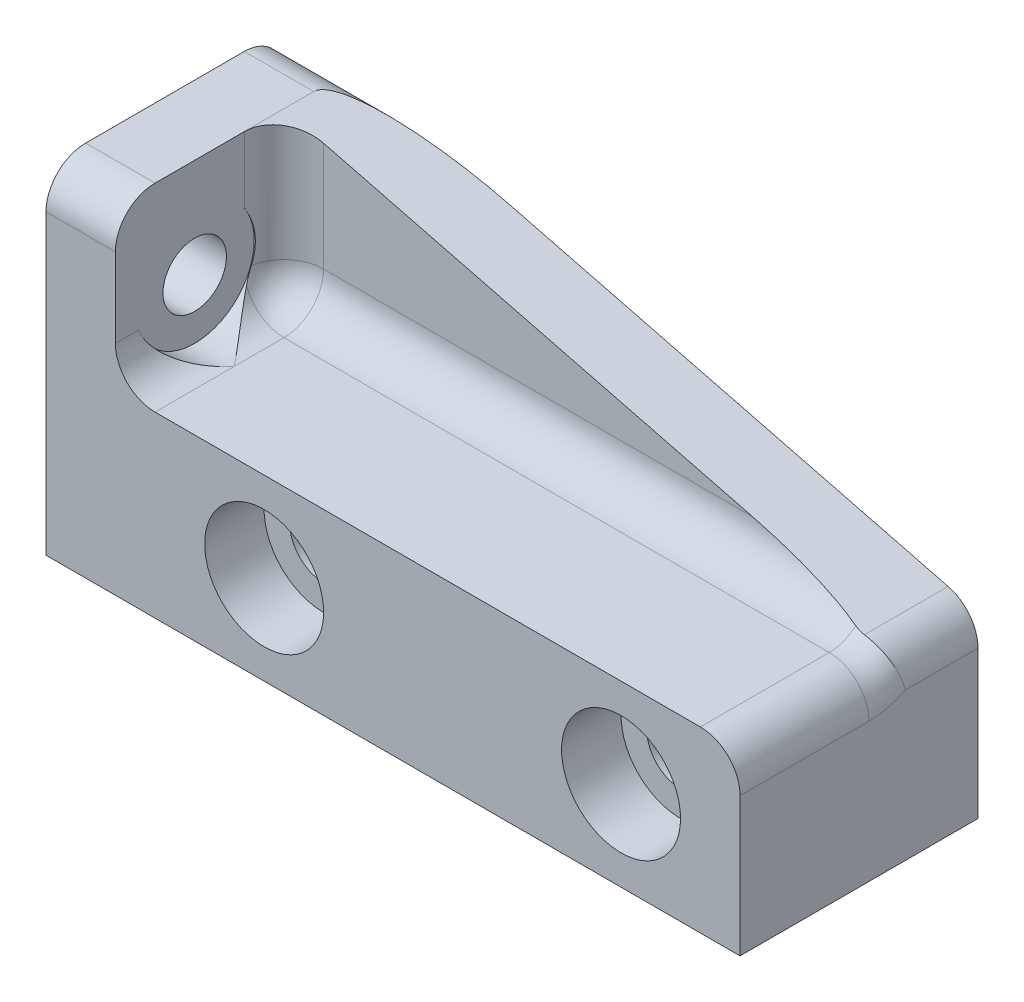
ISO-10303-21;
HEADER;
FILE_DESCRIPTION(('STEP AP214'),'2;1');
FILE_NAME('part.step','',(''),(''),'','','');
FILE_SCHEMA(('AUTOMOTIVE_DESIGN { 1 0 10303 214 1 1 1 1 }'));
ENDSEC;
DATA;
#1=APPLICATION_CONTEXT('core data for automotive mechanical design processes');
#2=APPLICATION_PROTOCOL_DEFINITION('international standard','automotive_design',2000,#1);
#3=PRODUCT_CONTEXT('',#1,'mechanical');
#4=PRODUCT('Part','Part','',(#3));
#5=PRODUCT_RELATED_PRODUCT_CATEGORY('part','',(#4));
#6=PRODUCT_DEFINITION_FORMATION('','',#4);
#7=PRODUCT_DEFINITION_CONTEXT('part definition',#1,'design');
#8=PRODUCT_DEFINITION('design','',#6,#7);
#9=PRODUCT_DEFINITION_SHAPE('','',#8);
#10=(LENGTH_UNIT() NAMED_UNIT(*) SI_UNIT(.MILLI.,.METRE.));
#11=(NAMED_UNIT(*) PLANE_ANGLE_UNIT() SI_UNIT($,.RADIAN.));
#12=(NAMED_UNIT(*) SI_UNIT($,.STERADIAN.) SOLID_ANGLE_UNIT());
#13=UNCERTAINTY_MEASURE_WITH_UNIT(LENGTH_MEASURE(1.E-05),#10,'distance_accuracy_value','');
#14=(GEOMETRIC_REPRESENTATION_CONTEXT(3) GLOBAL_UNCERTAINTY_ASSIGNED_CONTEXT((#13)) GLOBAL_UNIT_ASSIGNED_CONTEXT((#10,
#11,#12)) REPRESENTATION_CONTEXT('',''));
#15=CARTESIAN_POINT('',(0.,0.,0.));
#16=DIRECTION('',(0.,0.,1.));
#17=DIRECTION('',(1.,0.,0.));
#18=AXIS2_PLACEMENT_3D('',#15,#16,#17);
#19=CARTESIAN_POINT('',(5.5,9.,-0.5));
#20=DIRECTION('',(0.,1.,0.));
#21=DIRECTION('',(0.,0.,1.));
#22=AXIS2_PLACEMENT_3D('',#19,#20,#21);
#23=CYLINDRICAL_SURFACE('',#22,2.);
#24=CARTESIAN_POINT('',(3.52715037984875,11.,-0.82842712474619));
#25=CARTESIAN_POINT('',(3.53189991298424,11.0801036816719,-0.856756355130114));
#26=CARTESIAN_POINT('',(3.53664300234065,11.1614207307532,-0.881669700954694));
#27=CARTESIAN_POINT('',(3.54544271735924,11.3259263523737,-0.924523643053754));
#28=CARTESIAN_POINT('',(3.54949919291584,11.4091153296567,-0.942462715741101));
#29=CARTESIAN_POINT('',(3.5562392015569,11.576519795779,-0.971171019333512));
#30=CARTESIAN_POINT('',(3.55892686252882,11.6607314047323,-0.981961836942878));
#31=CARTESIAN_POINT('',(3.5625592916091,11.8297926854413,-0.996368556892306));
#32=CARTESIAN_POINT('',(3.56350432425526,11.9146422583876,-0.999985548253573));
#33=CARTESIAN_POINT('',(3.56351223530166,12.0828106555608,-1.00001410572426));
#34=CARTESIAN_POINT('',(3.56260876281958,12.1661294787536,-0.996554490570057));
#35=CARTESIAN_POINT('',(3.55911542003467,12.3321553612061,-0.982719062157077));
#36=CARTESIAN_POINT('',(3.55652549394236,12.4148624001358,-0.972343020096144));
#37=CARTESIAN_POINT('',(3.55002831178323,12.5790690375511,-0.944759336436719));
#38=CARTESIAN_POINT('',(3.54612120254997,12.6605687695649,-0.927552456270957));
#39=CARTESIAN_POINT('',(3.53757920599343,12.8217919167244,-0.886448472002528));
#40=CARTESIAN_POINT('',(3.53294441730627,12.9015155709453,-0.86255227428612));
#41=CARTESIAN_POINT('',(3.52129277185658,13.0995666708569,-0.794082581610691));
#42=CARTESIAN_POINT('',(3.51428799937989,13.216456017184,-0.745214181861962));
#43=CARTESIAN_POINT('',(3.50630729241284,13.3864347668809,-0.661165387421036));
#44=CARTESIAN_POINT('',(3.50406832661158,13.44219123167,-0.631365095659304));
#45=CARTESIAN_POINT('',(3.50091671505389,13.551762804179,-0.568273279204588));
#46=CARTESIAN_POINT('',(3.50000466471095,13.6055770298219,-0.534980194404839));
#47=CARTESIAN_POINT('',(3.5,13.6583123951777,-0.5));
#48=B_SPLINE_CURVE_WITH_KNOTS('',3,(#24,#25,#26,#27,#28,#29,#30,#31,#32,#33,#34,#35,#36,#37,#38,
#39,#40,#41,#42,#43,#44,#45,#46,#47),.UNSPECIFIED.,.F.,.F.,(4,2,2,2,2,2,2,2,2,2,2,4),(0.,
0.255226564086905,0.510508853220476,0.765016668807317,1.01948584592996,1.2693640399846,
1.51925050066423,1.76910911434701,2.01893388916886,2.39841219858438,2.58807580813261,
2.77782449731298),.UNSPECIFIED.);
#49=CARTESIAN_POINT('',(3.52715037984874,11.,-0.82842712474619));
#50=VERTEX_POINT('',#49);
#51=CARTESIAN_POINT('',(3.5,13.6583123951777,-0.5));
#52=VERTEX_POINT('',#51);
#53=EDGE_CURVE('E157',#50,#52,#48,.T.);
#54=ORIENTED_EDGE('',*,*,#53,.F.);
#55=CARTESIAN_POINT('',(5.5,11.,-0.5));
#56=DIRECTION('',(0.,1.,0.));
#57=DIRECTION('',(0.,0.,1.));
#58=AXIS2_PLACEMENT_3D('',#55,#56,#57);
#59=CIRCLE('',#58,2.);
#60=CARTESIAN_POINT('',(5.5,11.,-2.5));
#61=VERTEX_POINT('',#60);
#62=EDGE_CURVE('E244',#50,#61,#59,.F.);
#63=ORIENTED_EDGE('',*,*,#62,.T.);
#64=DIRECTION('',(0.,1.,0.));
#65=VECTOR('',#64,1.);
#66=CARTESIAN_POINT('',(5.5,9.,-2.5));
#67=LINE('',#66,#65);
#68=CARTESIAN_POINT('',(5.5,16.4920634920635,-2.5));
#69=VERTEX_POINT('',#68);
#70=EDGE_CURVE('E185',#61,#69,#67,.T.);
#71=ORIENTED_EDGE('',*,*,#70,.T.);
#72=CARTESIAN_POINT('',(5.5,16.4920634920635,-0.5));
#73=DIRECTION('',(-0.246153846153846,-0.969230769230769,0.));
#74=DIRECTION('',(-0.969230769230769,0.246153846153846,0.));
#75=AXIS2_PLACEMENT_3D('',#72,#73,#74);
#76=ELLIPSE('',#75,2.06349206349206,2.);
#77=CARTESIAN_POINT('',(3.5,17.,-0.5));
#78=VERTEX_POINT('',#77);
#79=EDGE_CURVE('E183',#78,#69,#76,.T.);
#80=ORIENTED_EDGE('',*,*,#79,.F.);
#81=DIRECTION('',(0.,1.,0.));
#82=VECTOR('',#81,1.);
#83=CARTESIAN_POINT('',(3.5,9.,-0.5));
#84=LINE('',#83,#82);
#85=EDGE_CURVE('E174',#52,#78,#84,.T.);
#86=ORIENTED_EDGE('',*,*,#85,.F.);
#87=EDGE_LOOP('',(#54,#63,#71,#80,#86));
#88=FACE_BOUND('',#87,.T.);
#89=ADVANCED_FACE('F36',(#88),#23,.F.);
#90=CARTESIAN_POINT('',(5.5,11.,-0.5));
#91=DIRECTION('',(0.,0.,-1.));
#92=DIRECTION('',(-1.,0.,0.));
#93=AXIS2_PLACEMENT_3D('',#90,#91,#92);
#94=CYLINDRICAL_SURFACE('',#93,2.);
#95=CARTESIAN_POINT('',(3.5,11.,4.82842712474619));
#96=CARTESIAN_POINT('',(3.49999155503509,10.9436159444474,4.80850705026882));
#97=CARTESIAN_POINT('',(3.50238347095707,10.8878690947586,4.78688697304806));
#98=CARTESIAN_POINT('',(3.51158389686027,10.778149027859,4.74054721221962));
#99=CARTESIAN_POINT('',(3.51838564428017,10.7241732276431,4.71583232131472));
#100=CARTESIAN_POINT('',(3.5359349910355,10.6188529678948,4.66380432454253));
#101=CARTESIAN_POINT('',(3.54664212178407,10.5674874674884,4.63651992237469));
#102=CARTESIAN_POINT('',(3.57161665691398,10.4670669910103,4.5794299188087));
#103=CARTESIAN_POINT('',(3.58588573867057,10.4180131164919,4.54962313396701));
#104=CARTESIAN_POINT('',(3.64067309364308,10.2528931537752,4.44276479519332));
#105=CARTESIAN_POINT('',(3.68920087639876,10.1430488576841,4.3600093087302));
#106=CARTESIAN_POINT('',(3.80042012910901,9.93933803827302,4.18447181665511));
#107=CARTESIAN_POINT('',(3.86317432497028,9.84554560467289,4.09164638643719));
#108=CARTESIAN_POINT('',(4.02506668300534,9.64074279636963,3.86169239665388));
#109=CARTESIAN_POINT('',(4.12888978797449,9.5371027212905,3.72131415806271));
#110=CARTESIAN_POINT('',(4.34870842794342,9.3584666820652,3.43222170945872));
#111=CARTESIAN_POINT('',(4.46472077181743,9.28351095210631,3.2834961236372));
#112=CARTESIAN_POINT('',(4.6567580725223,9.18463330967702,3.0408862776505));
#113=CARTESIAN_POINT('',(4.73049496647768,9.15224520363726,2.94852308440781));
#114=CARTESIAN_POINT('',(4.87987495247718,9.09689779523984,2.76251278895453));
#115=CARTESIAN_POINT('',(4.95551866561971,9.07394160833672,2.66886527305768));
#116=CARTESIAN_POINT('',(5.18393402433867,9.01894485126977,2.38710974946024));
#117=CARTESIAN_POINT('',(5.33865085771288,9.00054659366592,2.19761167410244));
#118=CARTESIAN_POINT('',(5.49538126864263,9.00000400481877,2.0056567697596));
#119=CARTESIAN_POINT('',(5.49769067225477,9.00000000521536,2.00282833958387));
#120=CARTESIAN_POINT('',(5.5,9.,2.));
#121=B_SPLINE_CURVE_WITH_KNOTS('',3,(#95,#96,#97,#98,#99,#100,#101,#102,#103,#104,#105,#106,
#107,#108,#109,#110,#111,#112,#113,#114,#115,#116,#117,#118,#119,#120),.UNSPECIFIED.,.F.,.F.,(4,
2,2,2,2,2,2,2,2,2,2,2,4),(0.,0.179272158824189,0.358270048541645,0.535463494925216,
0.712740542250158,1.1476657966333,1.58454732757419,2.19039501983581,2.79708941843105,
3.16434808038177,3.53172795410131,4.2641894371729,4.2751438948957),.UNSPECIFIED.);
#122=CARTESIAN_POINT('',(3.5,11.,4.82842712474619));
#123=VERTEX_POINT('',#122);
#124=CARTESIAN_POINT('',(5.5,9.,2.));
#125=VERTEX_POINT('',#124);
#126=EDGE_CURVE('E167',#123,#125,#121,.T.);
#127=ORIENTED_EDGE('',*,*,#126,.F.);
#128=DIRECTION('',(0.,0.,1.));
#129=VECTOR('',#128,1.);
#130=CARTESIAN_POINT('',(3.5,11.,-0.5));
#131=LINE('',#130,#129);
#132=CARTESIAN_POINT('',(3.5,11.,6.));
#133=VERTEX_POINT('',#132);
#134=EDGE_CURVE('E178',#133,#123,#131,.F.);
#135=ORIENTED_EDGE('',*,*,#134,.F.);
#136=CARTESIAN_POINT('',(5.5,11.,6.));
#137=DIRECTION('',(0.,0.,-1.));
#138=DIRECTION('',(-1.,0.,0.));
#139=AXIS2_PLACEMENT_3D('',#136,#137,#138);
#140=CIRCLE('',#139,2.);
#141=CARTESIAN_POINT('',(5.5,9.,6.));
#142=VERTEX_POINT('',#141);
#143=EDGE_CURVE('E280',#142,#133,#140,.T.);
#144=ORIENTED_EDGE('',*,*,#143,.F.);
#145=DIRECTION('',(0.,0.,1.));
#146=VECTOR('',#145,1.);
#147=CARTESIAN_POINT('',(5.5,9.,6.));
#148=LINE('',#147,#146);
#149=EDGE_CURVE('E238',#125,#142,#148,.T.);
#150=ORIENTED_EDGE('',*,*,#149,.F.);
#151=EDGE_LOOP('',(#127,#135,#144,#150));
#152=FACE_BOUND('',#151,.T.);
#153=ADVANCED_FACE('F379',(#152),#94,.F.);
#154=CARTESIAN_POINT('',(3.61144902362806,10.3416876048223,-0.5));
#155=CARTESIAN_POINT('',(3.6354738584879,10.2728013875921,-0.454311657768065));
#156=CARTESIAN_POINT('',(3.66273475248688,10.2066802087725,-0.40634804174376));
#157=CARTESIAN_POINT('',(3.7226812757042,10.0801990440978,-0.306690723319393));
#158=CARTESIAN_POINT('',(3.75535418003401,10.0198260552661,-0.255005927733869));
#159=CARTESIAN_POINT('',(3.82484830258931,9.905328072558,-0.149041259412858));
#160=CARTESIAN_POINT('',(3.86162472701856,9.85114659051555,-0.0947925387036213));
#161=CARTESIAN_POINT('',(3.93884333210317,9.74822945750991,0.0162500494615929));
#162=CARTESIAN_POINT('',(3.97928815397903,9.69949778765448,0.0730457355993894));
#163=CARTESIAN_POINT('',(4.12658132421704,9.53772993114496,0.276132104601567));
#164=CARTESIAN_POINT('',(4.24144381578439,9.43876192117986,0.428006022986698));
#165=CARTESIAN_POINT('',(4.48288807034124,9.2716582636873,0.739972323420995));
#166=CARTESIAN_POINT('',(4.60952423697882,9.20367528189962,0.900101162359794));
#167=CARTESIAN_POINT('',(4.86146569374453,9.1000832866827,1.21497432323524));
#168=CARTESIAN_POINT('',(4.98640038865766,9.06278612389105,1.36947067597026));
#169=CARTESIAN_POINT('',(5.23862240970049,9.01300560551972,1.67986815171144));
#170=CARTESIAN_POINT('',(5.365902064069,9.00045221925278,1.83576405201916));
#171=CARTESIAN_POINT('',(5.49538123827865,9.00000400551772,1.99434319472997));
#172=CARTESIAN_POINT('',(5.49769064162962,9.00000000588457,1.99717162449622));
#173=CARTESIAN_POINT('',(5.5,9.,2.));
#174=B_SPLINE_CURVE_WITH_KNOTS('',3,(#154,#155,#156,#157,#158,#159,#160,#161,#162,#163,#164,
#165,#166,#167,#168,#169,#170,#171,#172,#173),.UNSPECIFIED.,.F.,.F.,(4,2,2,2,2,2,2,2,2,4),(0.,
0.257959951576979,0.515321771862793,0.770107649744646,1.02507845036519,1.66522406910926,
2.30849051725418,2.91341438157485,3.51662369712718,3.52757815485243),.UNSPECIFIED.);
#175=CARTESIAN_POINT('',(3.61144902362806,10.3416876048223,-0.499999999999999));
#176=VERTEX_POINT('',#175);
#177=EDGE_CURVE('E179',#125,#176,#174,.F.);
#178=ORIENTED_EDGE('',*,*,#177,.F.);
#179=CARTESIAN_POINT('',(5.5,9.,-0.5));
#180=VERTEX_POINT('',#179);
#181=EDGE_CURVE('E239',#180,#125,#148,.T.);
#182=ORIENTED_EDGE('',*,*,#181,.F.);
#183=CARTESIAN_POINT('',(5.5,11.,-0.5));
#184=DIRECTION('',(0.,0.,1.));
#185=DIRECTION('',(0.,-1.,0.));
#186=AXIS2_PLACEMENT_3D('',#183,#184,#185);
#187=CIRCLE('',#186,2.);
#188=EDGE_CURVE('E650',#176,#180,#187,.T.);
#189=ORIENTED_EDGE('',*,*,#188,.F.);
#190=EDGE_LOOP('',(#178,#182,#189));
#191=FACE_BOUND('',#190,.T.);
#192=ADVANCED_FACE('F309',(#191),#94,.F.);
#193=CARTESIAN_POINT('',(5.5,11.,-0.5));
#194=DIRECTION('',(0.,-1.,0.));
#195=DIRECTION('',(0.,0.,-1.));
#196=AXIS2_PLACEMENT_3D('',#193,#194,#195);
#197=SPHERICAL_SURFACE('',#196,2.);
#198=CARTESIAN_POINT('',(3.61155414848141,10.3413861329411,-0.4998));
#199=CARTESIAN_POINT('',(3.59737582294971,10.3820155948853,-0.526769001529927));
#200=CARTESIAN_POINT('',(3.5848808806829,10.4237237556649,-0.553004473780035));
#201=CARTESIAN_POINT('',(3.56330672205065,10.5090514196322,-0.603751469955477));
#202=CARTESIAN_POINT('',(3.55422880592942,10.5526716433622,-0.628262334755761));
#203=CARTESIAN_POINT('',(3.53967586260973,10.6407751549645,-0.674874445436087));
#204=CARTESIAN_POINT('',(3.53414106170816,10.685230340725,-0.697010118098322));
#205=CARTESIAN_POINT('',(3.52645921899439,10.7754097683432,-0.739132940102168));
#206=CARTESIAN_POINT('',(3.52431070817935,10.8211334511507,-0.759121017581133));
#207=CARTESIAN_POINT('',(3.52342772302902,10.9112368600448,-0.795864159817583));
#208=CARTESIAN_POINT('',(3.52452796518666,10.9555695222196,-0.812730886865917));
#209=CARTESIAN_POINT('',(3.52716216141623,11.0002,-0.828497827469556));
#210=B_SPLINE_CURVE_WITH_KNOTS('',3,(#198,#199,#200,#201,#202,#203,#204,#205,#206,#207,#208,
#209),.UNSPECIFIED.,.F.,.F.,(4,2,2,2,2,4),(0.,0.15231612127329,0.304690143310494,
0.454420650443932,0.604086185252475,0.746270643936694),.UNSPECIFIED.);
#211=EDGE_CURVE('E11',#176,#50,#210,.T.);
#212=ORIENTED_EDGE('',*,*,#211,.F.);
#213=ORIENTED_EDGE('',*,*,#188,.T.);
#214=CARTESIAN_POINT('',(5.5,11.,-0.5));
#215=DIRECTION('',(-1.,0.,0.));
#216=DIRECTION('',(0.,0.,1.));
#217=AXIS2_PLACEMENT_3D('',#214,#215,#216);
#218=CIRCLE('',#217,2.);
#219=EDGE_CURVE('E289',#61,#180,#218,.T.);
#220=ORIENTED_EDGE('',*,*,#219,.F.);
#221=ORIENTED_EDGE('',*,*,#62,.F.);
#222=EDGE_LOOP('',(#212,#213,#220,#221));
#223=FACE_BOUND('',#222,.T.);
#224=ADVANCED_FACE('F304',(#223),#197,.F.);
#225=CARTESIAN_POINT('',(35.,12.,2.));
#226=DIRECTION('',(-1.,0.,0.));
#227=DIRECTION('',(0.,0.,1.));
#228=AXIS2_PLACEMENT_3D('',#225,#226,#227);
#229=CYLINDRICAL_SURFACE('',#228,1.6);
#230=CARTESIAN_POINT('',(0.,12.,2.));
#231=DIRECTION('',(-1.,0.,0.));
#232=DIRECTION('',(0.,0.,1.));
#233=AXIS2_PLACEMENT_3D('',#230,#231,#232);
#234=CIRCLE('',#233,1.6);
#235=CARTESIAN_POINT('',(0.,12.,3.6));
#236=VERTEX_POINT('',#235);
#237=EDGE_CURVE('E334',#236,#236,#234,.T.);
#238=ORIENTED_EDGE('',*,*,#237,.T.);
#239=EDGE_LOOP('',(#238));
#240=FACE_BOUND('',#239,.T.);
#241=CARTESIAN_POINT('',(3.5,12.,2.));
#242=DIRECTION('',(-1.,0.,0.));
#243=DIRECTION('',(0.,0.,1.));
#244=AXIS2_PLACEMENT_3D('',#241,#242,#243);
#245=CIRCLE('',#244,1.6);
#246=CARTESIAN_POINT('',(3.5,12.,3.6));
#247=VERTEX_POINT('',#246);
#248=EDGE_CURVE('E338',#247,#247,#245,.T.);
#249=ORIENTED_EDGE('',*,*,#248,.F.);
#250=EDGE_LOOP('',(#249));
#251=FACE_BOUND('',#250,.T.);
#252=ADVANCED_FACE('F308',(#240,#251),#229,.F.);
#253=CARTESIAN_POINT('',(11.,4.5,6.));
#254=DIRECTION('',(0.,0.,-1.));
#255=DIRECTION('',(-1.,0.,0.));
#256=AXIS2_PLACEMENT_3D('',#253,#254,#255);
#257=CYLINDRICAL_SURFACE('',#256,1.7);
#258=CARTESIAN_POINT('',(11.,4.5,-6.));
#259=DIRECTION('',(0.,0.,1.));
#260=DIRECTION('',(1.,0.,0.));
#261=AXIS2_PLACEMENT_3D('',#258,#259,#260);
#262=CIRCLE('',#261,1.7);
#263=CARTESIAN_POINT('',(12.7,4.5,-6.));
#264=VERTEX_POINT('',#263);
#265=EDGE_CURVE('E199',#264,#264,#262,.T.);
#266=ORIENTED_EDGE('',*,*,#265,.F.);
#267=EDGE_LOOP('',(#266));
#268=FACE_BOUND('',#267,.T.);
#269=CARTESIAN_POINT('',(11.,4.5,3.));
#270=DIRECTION('',(0.,0.,1.));
#271=DIRECTION('',(1.,0.,0.));
#272=AXIS2_PLACEMENT_3D('',#269,#270,#271);
#273=CIRCLE('',#272,1.7);
#274=CARTESIAN_POINT('',(12.7,4.5,3.));
#275=VERTEX_POINT('',#274);
#276=EDGE_CURVE('E331',#275,#275,#273,.T.);
#277=ORIENTED_EDGE('',*,*,#276,.T.);
#278=EDGE_LOOP('',(#277));
#279=FACE_BOUND('',#278,.T.);
#280=ADVANCED_FACE('F419',(#268,#279),#257,.F.);
#281=CARTESIAN_POINT('',(29.,4.5,6.));
#282=DIRECTION('',(0.,0.,-1.));
#283=DIRECTION('',(-1.,0.,0.));
#284=AXIS2_PLACEMENT_3D('',#281,#282,#283);
#285=CYLINDRICAL_SURFACE('',#284,1.7);
#286=CARTESIAN_POINT('',(29.,4.5,-6.));
#287=DIRECTION('',(0.,0.,1.));
#288=DIRECTION('',(1.,0.,0.));
#289=AXIS2_PLACEMENT_3D('',#286,#287,#288);
#290=CIRCLE('',#289,1.7);
#291=CARTESIAN_POINT('',(30.7,4.5,-6.));
#292=VERTEX_POINT('',#291);
#293=EDGE_CURVE('E187',#292,#292,#290,.T.);
#294=ORIENTED_EDGE('',*,*,#293,.F.);
#295=EDGE_LOOP('',(#294));
#296=FACE_BOUND('',#295,.T.);
#297=CARTESIAN_POINT('',(29.,4.5,3.));
#298=DIRECTION('',(0.,0.,1.));
#299=DIRECTION('',(1.,0.,0.));
#300=AXIS2_PLACEMENT_3D('',#297,#298,#299);
#301=CIRCLE('',#300,1.7);
#302=CARTESIAN_POINT('',(30.7,4.5,3.));
#303=VERTEX_POINT('',#302);
#304=EDGE_CURVE('E329',#303,#303,#301,.T.);
#305=ORIENTED_EDGE('',*,*,#304,.T.);
#306=EDGE_LOOP('',(#305));
#307=FACE_BOUND('',#306,.T.);
#308=ADVANCED_FACE('F427',(#296,#307),#285,.F.);
#309=CARTESIAN_POINT('',(0.,0.,6.));
#310=DIRECTION('',(0.,0.,-1.));
#311=DIRECTION('',(-1.,0.,0.));
#312=AXIS2_PLACEMENT_3D('',#309,#310,#311);
#313=PLANE('',#312);
#314=CARTESIAN_POINT('',(11.,4.5,6.));
#315=DIRECTION('',(0.,0.,1.));
#316=DIRECTION('',(1.,0.,0.));
#317=AXIS2_PLACEMENT_3D('',#314,#315,#316);
#318=CIRCLE('',#317,3.);
#319=CARTESIAN_POINT('',(14.,4.5,6.));
#320=VERTEX_POINT('',#319);
#321=EDGE_CURVE('E349',#320,#320,#318,.T.);
#322=ORIENTED_EDGE('',*,*,#321,.F.);
#323=EDGE_LOOP('',(#322));
#324=FACE_BOUND('',#323,.T.);
#325=CARTESIAN_POINT('',(29.,4.5,6.));
#326=DIRECTION('',(0.,0.,1.));
#327=DIRECTION('',(1.,0.,0.));
#328=AXIS2_PLACEMENT_3D('',#325,#326,#327);
#329=CIRCLE('',#328,3.);
#330=CARTESIAN_POINT('',(32.,4.5,6.));
#331=VERTEX_POINT('',#330);
#332=EDGE_CURVE('E166',#331,#331,#329,.T.);
#333=ORIENTED_EDGE('',*,*,#332,.F.);
#334=EDGE_LOOP('',(#333));
#335=FACE_BOUND('',#334,.T.);
#336=DIRECTION('',(0.,1.,0.));
#337=VECTOR('',#336,1.);
#338=CARTESIAN_POINT('',(35.,0.,6.));
#339=LINE('',#338,#337);
#340=CARTESIAN_POINT('',(35.,0.,6.));
#341=VERTEX_POINT('',#340);
#342=CARTESIAN_POINT('',(35.,7.,6.));
#343=VERTEX_POINT('',#342);
#344=EDGE_CURVE('E208',#341,#343,#339,.T.);
#345=ORIENTED_EDGE('',*,*,#344,.T.);
#346=CARTESIAN_POINT('',(33.,7.,6.));
#347=DIRECTION('',(0.,0.,-1.));
#348=DIRECTION('',(-1.,0.,0.));
#349=AXIS2_PLACEMENT_3D('',#346,#347,#348);
#350=CIRCLE('',#349,2.);
#351=CARTESIAN_POINT('',(33.,9.,6.));
#352=VERTEX_POINT('',#351);
#353=EDGE_CURVE('E275',#343,#352,#350,.F.);
#354=ORIENTED_EDGE('',*,*,#353,.T.);
#355=DIRECTION('',(1.,0.,0.));
#356=VECTOR('',#355,1.);
#357=CARTESIAN_POINT('',(3.5,9.,6.));
#358=LINE('',#357,#356);
#359=EDGE_CURVE('E192',#142,#352,#358,.T.);
#360=ORIENTED_EDGE('',*,*,#359,.F.);
#361=ORIENTED_EDGE('',*,*,#143,.T.);
#362=DIRECTION('',(0.,1.,0.));
#363=VECTOR('',#362,1.);
#364=CARTESIAN_POINT('',(3.5,9.,6.));
#365=LINE('',#364,#363);
#366=CARTESIAN_POINT('',(3.5,15.,6.));
#367=VERTEX_POINT('',#366);
#368=EDGE_CURVE('E189',#133,#367,#365,.T.);
#369=ORIENTED_EDGE('',*,*,#368,.T.);
#370=DIRECTION('',(-1.,0.,0.));
#371=VECTOR('',#370,1.);
#372=CARTESIAN_POINT('',(0.,15.,6.));
#373=LINE('',#372,#371);
#374=CARTESIAN_POINT('',(0.,15.,6.));
#375=VERTEX_POINT('',#374);
#376=EDGE_CURVE('E272',#367,#375,#373,.T.);
#377=ORIENTED_EDGE('',*,*,#376,.T.);
#378=DIRECTION('',(0.,-1.,0.));
#379=VECTOR('',#378,1.);
#380=CARTESIAN_POINT('',(0.,0.,6.));
#381=LINE('',#380,#379);
#382=CARTESIAN_POINT('',(0.,0.,6.));
#383=VERTEX_POINT('',#382);
#384=EDGE_CURVE('E203',#375,#383,#381,.T.);
#385=ORIENTED_EDGE('',*,*,#384,.T.);
#386=DIRECTION('',(1.,0.,0.));
#387=VECTOR('',#386,1.);
#388=CARTESIAN_POINT('',(0.,0.,6.));
#389=LINE('',#388,#387);
#390=EDGE_CURVE('E205',#383,#341,#389,.T.);
#391=ORIENTED_EDGE('',*,*,#390,.T.);
#392=EDGE_LOOP('',(#345,#354,#360,#361,#369,#377,#385,#391));
#393=FACE_BOUND('',#392,.T.);
#394=ADVANCED_FACE('F436',(#324,#335,#393),#313,.F.);
#395=CARTESIAN_POINT('',(0.,0.,-6.));
#396=DIRECTION('',(0.,0.,-1.));
#397=DIRECTION('',(-1.,0.,0.));
#398=AXIS2_PLACEMENT_3D('',#395,#396,#397);
#399=PLANE('',#398);
#400=ORIENTED_EDGE('',*,*,#265,.T.);
#401=EDGE_LOOP('',(#400));
#402=FACE_BOUND('',#401,.T.);
#403=DIRECTION('',(-0.969230769230769,0.246153846153846,0.));
#404=VECTOR('',#403,1.);
#405=CARTESIAN_POINT('',(35.,9.,-6.));
#406=LINE('',#405,#404);
#407=CARTESIAN_POINT('',(33.4923076923077,9.38290598290598,-6.));
#408=VERTEX_POINT('',#407);
#409=CARTESIAN_POINT('',(11.375,15.,-6.));
#410=VERTEX_POINT('',#409);
#411=EDGE_CURVE('E206',#408,#410,#406,.T.);
#412=ORIENTED_EDGE('',*,*,#411,.F.);
#413=CARTESIAN_POINT('',(33.,7.44444444444444,-6.));
#414=DIRECTION('',(0.,0.,-1.));
#415=DIRECTION('',(-1.,0.,0.));
#416=AXIS2_PLACEMENT_3D('',#413,#414,#415);
#417=CIRCLE('',#416,2.);
#418=CARTESIAN_POINT('',(35.,7.44444444444444,-6.));
#419=VERTEX_POINT('',#418);
#420=EDGE_CURVE('E252',#408,#419,#417,.T.);
#421=ORIENTED_EDGE('',*,*,#420,.T.);
#422=DIRECTION('',(0.,1.,0.));
#423=VECTOR('',#422,1.);
#424=CARTESIAN_POINT('',(35.,0.,-6.));
#425=LINE('',#424,#423);
#426=CARTESIAN_POINT('',(35.,0.,-6.));
#427=VERTEX_POINT('',#426);
#428=EDGE_CURVE('E215',#427,#419,#425,.T.);
#429=ORIENTED_EDGE('',*,*,#428,.F.);
#430=DIRECTION('',(1.,0.,0.));
#431=VECTOR('',#430,1.);
#432=CARTESIAN_POINT('',(0.,0.,-6.));
#433=LINE('',#432,#431);
#434=CARTESIAN_POINT('',(0.,0.,-6.));
#435=VERTEX_POINT('',#434);
#436=EDGE_CURVE('E213',#435,#427,#433,.T.);
#437=ORIENTED_EDGE('',*,*,#436,.F.);
#438=DIRECTION('',(0.,-1.,0.));
#439=VECTOR('',#438,1.);
#440=CARTESIAN_POINT('',(0.,0.,-6.));
#441=LINE('',#440,#439);
#442=CARTESIAN_POINT('',(0.,15.,-6.));
#443=VERTEX_POINT('',#442);
#444=EDGE_CURVE('E202',#443,#435,#441,.T.);
#445=ORIENTED_EDGE('',*,*,#444,.F.);
#446=DIRECTION('',(-1.,0.,0.));
#447=VECTOR('',#446,1.);
#448=CARTESIAN_POINT('',(3.5,15.,-6.));
#449=LINE('',#448,#447);
#450=EDGE_CURVE('E250',#443,#410,#449,.F.);
#451=ORIENTED_EDGE('',*,*,#450,.T.);
#452=EDGE_LOOP('',(#412,#421,#429,#437,#445,#451));
#453=FACE_BOUND('',#452,.T.);
#454=ORIENTED_EDGE('',*,*,#293,.T.);
#455=EDGE_LOOP('',(#454));
#456=FACE_BOUND('',#455,.T.);
#457=ADVANCED_FACE('F444',(#402,#453,#456),#399,.T.);
#458=CARTESIAN_POINT('',(0.,0.,6.));
#459=DIRECTION('',(1.,0.,0.));
#460=DIRECTION('',(0.,0.,-1.));
#461=AXIS2_PLACEMENT_3D('',#458,#459,#460);
#462=PLANE('',#461);
#463=ORIENTED_EDGE('',*,*,#237,.F.);
#464=EDGE_LOOP('',(#463));
#465=FACE_BOUND('',#464,.T.);
#466=DIRECTION('',(0.,0.,-1.));
#467=VECTOR('',#466,1.);
#468=CARTESIAN_POINT('',(0.,17.,6.));
#469=LINE('',#468,#467);
#470=CARTESIAN_POINT('',(0.,17.,4.));
#471=VERTEX_POINT('',#470);
#472=CARTESIAN_POINT('',(0.,17.,-4.));
#473=VERTEX_POINT('',#472);
#474=EDGE_CURVE('E211',#471,#473,#469,.T.);
#475=ORIENTED_EDGE('',*,*,#474,.T.);
#476=CARTESIAN_POINT('',(0.,15.,-4.));
#477=DIRECTION('',(1.,0.,0.));
#478=DIRECTION('',(0.,0.,-1.));
#479=AXIS2_PLACEMENT_3D('',#476,#477,#478);
#480=CIRCLE('',#479,2.);
#481=EDGE_CURVE('E267',#473,#443,#480,.F.);
#482=ORIENTED_EDGE('',*,*,#481,.T.);
#483=ORIENTED_EDGE('',*,*,#444,.T.);
#484=DIRECTION('',(0.,0.,-1.));
#485=VECTOR('',#484,1.);
#486=CARTESIAN_POINT('',(0.,0.,6.));
#487=LINE('',#486,#485);
#488=EDGE_CURVE('E228',#383,#435,#487,.T.);
#489=ORIENTED_EDGE('',*,*,#488,.F.);
#490=ORIENTED_EDGE('',*,*,#384,.F.);
#491=CARTESIAN_POINT('',(0.,15.,4.));
#492=DIRECTION('',(1.,0.,0.));
#493=DIRECTION('',(0.,0.,-1.));
#494=AXIS2_PLACEMENT_3D('',#491,#492,#493);
#495=CIRCLE('',#494,2.);
#496=EDGE_CURVE('E265',#375,#471,#495,.F.);
#497=ORIENTED_EDGE('',*,*,#496,.T.);
#498=EDGE_LOOP('',(#475,#482,#483,#489,#490,#497));
#499=FACE_BOUND('',#498,.T.);
#500=ADVANCED_FACE('F298',(#465,#499),#462,.F.);
#501=CARTESIAN_POINT('',(0.,0.,6.));
#502=DIRECTION('',(0.,1.,0.));
#503=DIRECTION('',(0.,0.,1.));
#504=AXIS2_PLACEMENT_3D('',#501,#502,#503);
#505=PLANE('',#504);
#506=ORIENTED_EDGE('',*,*,#436,.T.);
#507=DIRECTION('',(0.,0.,-1.));
#508=VECTOR('',#507,1.);
#509=CARTESIAN_POINT('',(35.,0.,6.));
#510=LINE('',#509,#508);
#511=EDGE_CURVE('E225',#341,#427,#510,.T.);
#512=ORIENTED_EDGE('',*,*,#511,.F.);
#513=ORIENTED_EDGE('',*,*,#390,.F.);
#514=ORIENTED_EDGE('',*,*,#488,.T.);
#515=EDGE_LOOP('',(#506,#512,#513,#514));
#516=FACE_BOUND('',#515,.T.);
#517=ADVANCED_FACE('F461',(#516),#505,.F.);
#518=CARTESIAN_POINT('',(35.,0.,6.));
#519=DIRECTION('',(-1.,0.,0.));
#520=DIRECTION('',(0.,0.,1.));
#521=AXIS2_PLACEMENT_3D('',#518,#519,#520);
#522=PLANE('',#521);
#523=ORIENTED_EDGE('',*,*,#428,.T.);
#524=DIRECTION('',(0.,0.,-1.));
#525=VECTOR('',#524,1.);
#526=CARTESIAN_POINT('',(35.,7.44444444444444,6.));
#527=LINE('',#526,#525);
#528=CARTESIAN_POINT('',(35.,7.44444444444444,-2.3324913891634));
#529=VERTEX_POINT('',#528);
#530=EDGE_CURVE('E258',#419,#529,#527,.F.);
#531=ORIENTED_EDGE('',*,*,#530,.T.);
#532=CARTESIAN_POINT('',(35.,11.,-0.5));
#533=DIRECTION('',(-1.,0.,0.));
#534=DIRECTION('',(0.,0.,1.));
#535=AXIS2_PLACEMENT_3D('',#532,#533,#534);
#536=CIRCLE('',#535,4.);
#537=CARTESIAN_POINT('',(35.,7.,-0.5));
#538=VERTEX_POINT('',#537);
#539=EDGE_CURVE('E256',#529,#538,#536,.T.);
#540=ORIENTED_EDGE('',*,*,#539,.T.);
#541=DIRECTION('',(0.,0.,-1.));
#542=VECTOR('',#541,1.);
#543=CARTESIAN_POINT('',(35.,7.,6.));
#544=LINE('',#543,#542);
#545=EDGE_CURVE('E254',#538,#343,#544,.F.);
#546=ORIENTED_EDGE('',*,*,#545,.T.);
#547=ORIENTED_EDGE('',*,*,#344,.F.);
#548=ORIENTED_EDGE('',*,*,#511,.T.);
#549=EDGE_LOOP('',(#523,#531,#540,#546,#547,#548));
#550=FACE_BOUND('',#549,.T.);
#551=ADVANCED_FACE('F468',(#550),#522,.F.);
#552=CARTESIAN_POINT('',(35.,9.,6.));
#553=DIRECTION('',(-0.246153846153846,-0.969230769230769,0.));
#554=DIRECTION('',(0.969230769230769,-0.246153846153846,0.));
#555=AXIS2_PLACEMENT_3D('',#552,#553,#554);
#556=PLANE('',#555);
#557=CARTESIAN_POINT('',(27.125,11.,-0.5));
#558=DIRECTION('',(-0.246153846153846,-0.969230769230769,0.));
#559=DIRECTION('',(0.969230769230769,-0.246153846153846,0.));
#560=AXIS2_PLACEMENT_3D('',#557,#558,#559);
#561=ELLIPSE('',#560,8.125,2.);
#562=CARTESIAN_POINT('',(27.125,11.,-2.5));
#563=VERTEX_POINT('',#562);
#564=CARTESIAN_POINT('',(33.,9.50793650793651,-1.83182075958115));
#565=VERTEX_POINT('',#564);
#566=EDGE_CURVE('E61',#563,#565,#561,.T.);
#567=ORIENTED_EDGE('',*,*,#566,.T.);
#568=CARTESIAN_POINT('',(33.,9.50793650793651,-1.83182075958115));
#569=CARTESIAN_POINT('',(33.0401034874192,9.49775149525862,-1.82041122090013));
#570=CARTESIAN_POINT('',(33.0806246761754,9.48746039970149,-1.81042958031239));
#571=CARTESIAN_POINT('',(33.1619796643632,9.46679881539983,-1.79387998823277));
#572=CARTESIAN_POINT('',(33.2028084971863,9.45642958801617,-1.78728580087225));
#573=CARTESIAN_POINT('',(33.284912228032,9.43557784684903,-1.77787212977328));
#574=CARTESIAN_POINT('',(33.3261873234118,9.42509528294304,-1.77505439126171));
#575=CARTESIAN_POINT('',(33.4091284800655,9.40403086220559,-1.77358081273035));
#576=CARTESIAN_POINT('',(33.4507950478798,9.39344887672894,-1.77495812563155));
#577=CARTESIAN_POINT('',(33.4923076923075,9.38290598290603,-1.77865076087299));
#578=B_SPLINE_CURVE_WITH_KNOTS('',3,(#568,#569,#570,#571,#572,#573,#574,#575,#576,#577),
.UNSPECIFIED.,.F.,.F.,(4,2,2,2,4),(0.,0.128789753908425,0.25656639249183,0.384402060715569,
0.513250611013944),.UNSPECIFIED.);
#579=CARTESIAN_POINT('',(33.4923076923077,9.38290598290598,-1.77865076087365));
#580=VERTEX_POINT('',#579);
#581=EDGE_CURVE('E50',#565,#580,#578,.T.);
#582=ORIENTED_EDGE('',*,*,#581,.T.);
#583=DIRECTION('',(0.,0.,-1.));
#584=VECTOR('',#583,1.);
#585=CARTESIAN_POINT('',(33.4923076923077,9.38290598290598,6.));
#586=LINE('',#585,#584);
#587=CARTESIAN_POINT('',(33.4923076923077,9.38290598290598,-2.5));
#588=VERTEX_POINT('',#587);
#589=EDGE_CURVE('E278',#580,#588,#586,.T.);
#590=ORIENTED_EDGE('',*,*,#589,.T.);
#591=DIRECTION('',(0.,0.,-1.));
#592=VECTOR('',#591,1.);
#593=CARTESIAN_POINT('',(33.4923076923077,9.38290598290598,6.));
#594=LINE('',#593,#592);
#595=EDGE_CURVE('E248',#588,#408,#594,.T.);
#596=ORIENTED_EDGE('',*,*,#595,.T.);
#597=ORIENTED_EDGE('',*,*,#411,.T.);
#598=CARTESIAN_POINT('',(11.375,15.,-4.));
#599=DIRECTION('',(-0.246153846153846,-0.969230769230769,0.));
#600=DIRECTION('',(0.969230769230769,-0.246153846153846,0.));
#601=AXIS2_PLACEMENT_3D('',#598,#599,#600);
#602=ELLIPSE('',#601,8.125,2.);
#603=CARTESIAN_POINT('',(3.5,17.,-4.));
#604=VERTEX_POINT('',#603);
#605=EDGE_CURVE('E246',#410,#604,#602,.F.);
#606=ORIENTED_EDGE('',*,*,#605,.T.);
#607=DIRECTION('',(0.,0.,-1.));
#608=VECTOR('',#607,1.);
#609=CARTESIAN_POINT('',(3.5,17.,6.));
#610=LINE('',#609,#608);
#611=EDGE_CURVE('E222',#78,#604,#610,.T.);
#612=ORIENTED_EDGE('',*,*,#611,.F.);
#613=ORIENTED_EDGE('',*,*,#79,.T.);
#614=DIRECTION('',(0.969230769230769,-0.246153846153846,0.));
#615=VECTOR('',#614,1.);
#616=CARTESIAN_POINT('',(35.,9.,-2.5));
#617=LINE('',#616,#615);
#618=EDGE_CURVE('E231',#69,#563,#617,.T.);
#619=ORIENTED_EDGE('',*,*,#618,.T.);
#620=EDGE_LOOP('',(#567,#582,#590,#596,#597,#606,#612,#613,#619));
#621=FACE_BOUND('',#620,.T.);
#622=ADVANCED_FACE('F474',(#621),#556,.F.);
#623=CARTESIAN_POINT('',(0.,17.,6.));
#624=DIRECTION('',(0.,-1.,0.));
#625=DIRECTION('',(0.,0.,-1.));
#626=AXIS2_PLACEMENT_3D('',#623,#624,#625);
#627=PLANE('',#626);
#628=ORIENTED_EDGE('',*,*,#611,.T.);
#629=DIRECTION('',(-1.,0.,0.));
#630=VECTOR('',#629,1.);
#631=CARTESIAN_POINT('',(0.,17.,-4.));
#632=LINE('',#631,#630);
#633=EDGE_CURVE('E262',#604,#473,#632,.T.);
#634=ORIENTED_EDGE('',*,*,#633,.T.);
#635=ORIENTED_EDGE('',*,*,#474,.F.);
#636=DIRECTION('',(-1.,0.,0.));
#637=VECTOR('',#636,1.);
#638=CARTESIAN_POINT('',(0.,17.,4.));
#639=LINE('',#638,#637);
#640=CARTESIAN_POINT('',(3.5,17.,4.));
#641=VERTEX_POINT('',#640);
#642=EDGE_CURVE('E260',#471,#641,#639,.F.);
#643=ORIENTED_EDGE('',*,*,#642,.T.);
#644=EDGE_CURVE('E223',#641,#78,#610,.T.);
#645=ORIENTED_EDGE('',*,*,#644,.T.);
#646=EDGE_LOOP('',(#628,#634,#635,#643,#645));
#647=FACE_BOUND('',#646,.T.);
#648=ADVANCED_FACE('F482',(#647),#627,.F.);
#649=CARTESIAN_POINT('',(5.5,9.,-2.5));
#650=DIRECTION('',(0.,0.,-1.));
#651=DIRECTION('',(-1.,0.,0.));
#652=AXIS2_PLACEMENT_3D('',#649,#650,#651);
#653=PLANE('',#652);
#654=ORIENTED_EDGE('',*,*,#70,.F.);
#655=DIRECTION('',(-1.,0.,0.));
#656=VECTOR('',#655,1.);
#657=CARTESIAN_POINT('',(35.,11.,-2.5));
#658=LINE('',#657,#656);
#659=EDGE_CURVE('E242',#61,#563,#658,.F.);
#660=ORIENTED_EDGE('',*,*,#659,.T.);
#661=ORIENTED_EDGE('',*,*,#618,.F.);
#662=EDGE_LOOP('',(#654,#660,#661));
#663=FACE_BOUND('',#662,.T.);
#664=ADVANCED_FACE('F489',(#663),#653,.F.);
#665=CARTESIAN_POINT('',(3.5,9.,6.));
#666=DIRECTION('',(-1.,0.,0.));
#667=DIRECTION('',(0.,0.,1.));
#668=AXIS2_PLACEMENT_3D('',#665,#666,#667);
#669=PLANE('',#668);
#670=CARTESIAN_POINT('',(3.5,12.,2.));
#671=DIRECTION('',(1.,0.,0.));
#672=DIRECTION('',(0.,0.,-1.));
#673=AXIS2_PLACEMENT_3D('',#670,#671,#672);
#674=CIRCLE('',#673,3.);
#675=EDGE_CURVE('E160',#123,#52,#674,.T.);
#676=ORIENTED_EDGE('',*,*,#675,.T.);
#677=ORIENTED_EDGE('',*,*,#85,.T.);
#678=ORIENTED_EDGE('',*,*,#644,.F.);
#679=CARTESIAN_POINT('',(3.5,15.,4.));
#680=DIRECTION('',(-1.,0.,0.));
#681=DIRECTION('',(0.,0.,1.));
#682=AXIS2_PLACEMENT_3D('',#679,#680,#681);
#683=CIRCLE('',#682,2.);
#684=EDGE_CURVE('E269',#641,#367,#683,.F.);
#685=ORIENTED_EDGE('',*,*,#684,.T.);
#686=ORIENTED_EDGE('',*,*,#368,.F.);
#687=ORIENTED_EDGE('',*,*,#134,.T.);
#688=EDGE_LOOP('',(#676,#677,#678,#685,#686,#687));
#689=FACE_BOUND('',#688,.T.);
#690=ORIENTED_EDGE('',*,*,#248,.T.);
#691=EDGE_LOOP('',(#690));
#692=FACE_BOUND('',#691,.T.);
#693=ADVANCED_FACE('F171',(#689,#692),#669,.F.);
#694=CARTESIAN_POINT('',(5.5,9.,-0.5));
#695=DIRECTION('',(0.,-1.,0.));
#696=DIRECTION('',(0.,0.,-1.));
#697=AXIS2_PLACEMENT_3D('',#694,#695,#696);
#698=PLANE('',#697);
#699=DIRECTION('',(-1.,0.,0.));
#700=VECTOR('',#699,1.);
#701=CARTESIAN_POINT('',(5.5,9.,-0.5));
#702=LINE('',#701,#700);
#703=CARTESIAN_POINT('',(33.,9.,-0.5));
#704=VERTEX_POINT('',#703);
#705=EDGE_CURVE('E235',#704,#180,#702,.T.);
#706=ORIENTED_EDGE('',*,*,#705,.T.);
#707=ORIENTED_EDGE('',*,*,#181,.T.);
#708=ORIENTED_EDGE('',*,*,#149,.T.);
#709=ORIENTED_EDGE('',*,*,#359,.T.);
#710=DIRECTION('',(0.,0.,-1.));
#711=VECTOR('',#710,1.);
#712=CARTESIAN_POINT('',(33.,9.,-0.5));
#713=LINE('',#712,#711);
#714=EDGE_CURVE('E233',#352,#704,#713,.T.);
#715=ORIENTED_EDGE('',*,*,#714,.T.);
#716=EDGE_LOOP('',(#706,#707,#708,#709,#715));
#717=FACE_BOUND('',#716,.T.);
#718=ADVANCED_FACE('F315',(#717),#698,.F.);
#719=CARTESIAN_POINT('',(33.,7.44444444444444,6.));
#720=DIRECTION('',(0.,0.,-1.));
#721=DIRECTION('',(-1.,0.,0.));
#722=AXIS2_PLACEMENT_3D('',#719,#720,#721);
#723=CYLINDRICAL_SURFACE('',#722,2.);
#724=ORIENTED_EDGE('',*,*,#595,.F.);
#725=ORIENTED_EDGE('',*,*,#589,.F.);
#726=CARTESIAN_POINT('',(33.4923076923077,9.38290598290598,-1.77865076087365));
#727=CARTESIAN_POINT('',(33.5464584794394,9.36915420962956,-1.7834292689315));
#728=CARTESIAN_POINT('',(33.5999386192058,9.35315442196252,-1.78896527319025));
#729=CARTESIAN_POINT('',(33.7052170460942,9.31681482688409,-1.8014358782625));
#730=CARTESIAN_POINT('',(33.75701586271,9.29647640140939,-1.80837003370045));
#731=CARTESIAN_POINT('',(33.9090911146514,9.22932178169347,-1.83104989262706));
#732=CARTESIAN_POINT('',(34.0064127662083,9.17627216780119,-1.84870650626121));
#733=CARTESIAN_POINT('',(34.190313855981,9.05542872910893,-1.88795603504057));
#734=CARTESIAN_POINT('',(34.2769017800208,8.98764666967325,-1.90954580694293));
#735=CARTESIAN_POINT('',(34.4374978848733,8.83927463158461,-1.9555772326321));
#736=CARTESIAN_POINT('',(34.5114995596717,8.75867807032511,-1.98002035041282));
#737=CARTESIAN_POINT('',(34.647531009442,8.5838898325543,-2.03162430260049));
#738=CARTESIAN_POINT('',(34.7090508377462,8.48932092886231,-2.05885033058626));
#739=CARTESIAN_POINT('',(34.8152779394994,8.29142066845985,-2.11428771605722));
#740=CARTESIAN_POINT('',(34.8599856103683,8.18808951894957,-2.14249905023368));
#741=CARTESIAN_POINT('',(34.9249255629889,7.99496364418102,-2.19387441314913));
#742=CARTESIAN_POINT('',(34.9481382838506,7.90614819989527,-2.2170182009148));
#743=CARTESIAN_POINT('',(34.9821593520361,7.72621939016221,-2.26297588796755));
#744=CARTESIAN_POINT('',(34.9929917798333,7.6351108391327,-2.28579034214776));
#745=CARTESIAN_POINT('',(34.9989664401957,7.51491398034288,-2.31533344386219));
#746=CARTESIAN_POINT('',(34.9997738078392,7.48610684307503,-2.32237222318555));
#747=CARTESIAN_POINT('',(34.9999862422276,7.453005842099,-2.33041406104816));
#748=CARTESIAN_POINT('',(34.9999999840811,7.44872526470748,-2.33145313571458));
#749=CARTESIAN_POINT('',(35.,7.44444444444444,-2.3324913891634));
#750=B_SPLINE_CURVE_WITH_KNOTS('',3,(#726,#727,#728,#729,#730,#731,#732,#733,#734,#735,#736,
#737,#738,#739,#740,#741,#742,#743,#744,#745,#746,#747,#748,#749),.UNSPECIFIED.,.F.,.F.,(4,2,2,
2,2,2,2,2,2,2,2,4),(0.,0.168106705212834,0.336159945056598,0.671142211701948,1.00585793729683,
1.3407461598843,1.6873609001357,2.03396744629837,2.3172022762225,2.59988525338989,
2.68886456976598,2.7020792342104),.UNSPECIFIED.);
#751=EDGE_CURVE('E319',#529,#580,#750,.F.);
#752=ORIENTED_EDGE('',*,*,#751,.F.);
#753=ORIENTED_EDGE('',*,*,#530,.F.);
#754=ORIENTED_EDGE('',*,*,#420,.F.);
#755=EDGE_LOOP('',(#724,#725,#752,#753,#754));
#756=FACE_BOUND('',#755,.T.);
#757=ADVANCED_FACE('F311',(#756),#723,.T.);
#758=CARTESIAN_POINT('',(33.,7.,-0.5));
#759=DIRECTION('',(0.,0.,-1.));
#760=DIRECTION('',(-1.,0.,0.));
#761=AXIS2_PLACEMENT_3D('',#758,#759,#760);
#762=CYLINDRICAL_SURFACE('',#761,2.);
#763=ORIENTED_EDGE('',*,*,#353,.F.);
#764=ORIENTED_EDGE('',*,*,#545,.F.);
#765=CARTESIAN_POINT('',(33.,7.,-0.5));
#766=DIRECTION('',(0.,0.,1.));
#767=DIRECTION('',(1.,0.,0.));
#768=AXIS2_PLACEMENT_3D('',#765,#766,#767);
#769=CIRCLE('',#768,2.);
#770=EDGE_CURVE('E327',#704,#538,#769,.F.);
#771=ORIENTED_EDGE('',*,*,#770,.F.);
#772=ORIENTED_EDGE('',*,*,#714,.F.);
#773=EDGE_LOOP('',(#763,#764,#771,#772));
#774=FACE_BOUND('',#773,.T.);
#775=ADVANCED_FACE('F314',(#774),#762,.T.);
#776=CARTESIAN_POINT('',(33.,11.,-0.5));
#777=DIRECTION('',(-1.,0.,0.));
#778=DIRECTION('',(0.,0.,1.));
#779=AXIS2_PLACEMENT_3D('',#776,#777,#778);
#780=TOROIDAL_SURFACE('',#779,4.,2.);
#781=ORIENTED_EDGE('',*,*,#751,.T.);
#782=ORIENTED_EDGE('',*,*,#581,.F.);
#783=CARTESIAN_POINT('',(33.,11.,-0.5));
#784=DIRECTION('',(-1.,0.,0.));
#785=DIRECTION('',(0.,0.,1.));
#786=AXIS2_PLACEMENT_3D('',#783,#784,#785);
#787=CIRCLE('',#786,2.);
#788=EDGE_CURVE('E653',#704,#565,#787,.F.);
#789=ORIENTED_EDGE('',*,*,#788,.F.);
#790=ORIENTED_EDGE('',*,*,#770,.T.);
#791=ORIENTED_EDGE('',*,*,#539,.F.);
#792=EDGE_LOOP('',(#781,#782,#789,#790,#791));
#793=FACE_BOUND('',#792,.T.);
#794=ADVANCED_FACE('F291',(#793),#780,.T.);
#795=CARTESIAN_POINT('',(5.5,11.,-0.5));
#796=DIRECTION('',(1.,0.,0.));
#797=DIRECTION('',(0.,0.,-1.));
#798=AXIS2_PLACEMENT_3D('',#795,#796,#797);
#799=CYLINDRICAL_SURFACE('',#798,2.);
#800=ORIENTED_EDGE('',*,*,#566,.F.);
#801=ORIENTED_EDGE('',*,*,#659,.F.);
#802=ORIENTED_EDGE('',*,*,#219,.T.);
#803=ORIENTED_EDGE('',*,*,#705,.F.);
#804=ORIENTED_EDGE('',*,*,#788,.T.);
#805=EDGE_LOOP('',(#800,#801,#802,#803,#804));
#806=FACE_BOUND('',#805,.T.);
#807=ADVANCED_FACE('F300',(#806),#799,.F.);
#808=CARTESIAN_POINT('',(0.,15.,-4.));
#809=DIRECTION('',(1.,0.,0.));
#810=DIRECTION('',(0.,0.,-1.));
#811=AXIS2_PLACEMENT_3D('',#808,#809,#810);
#812=CYLINDRICAL_SURFACE('',#811,2.);
#813=ORIENTED_EDGE('',*,*,#605,.F.);
#814=ORIENTED_EDGE('',*,*,#450,.F.);
#815=ORIENTED_EDGE('',*,*,#481,.F.);
#816=ORIENTED_EDGE('',*,*,#633,.F.);
#817=EDGE_LOOP('',(#813,#814,#815,#816));
#818=FACE_BOUND('',#817,.T.);
#819=ADVANCED_FACE('F302',(#818),#812,.T.);
#820=CARTESIAN_POINT('',(0.,15.,4.));
#821=DIRECTION('',(-1.,0.,0.));
#822=DIRECTION('',(0.,0.,1.));
#823=AXIS2_PLACEMENT_3D('',#820,#821,#822);
#824=CYLINDRICAL_SURFACE('',#823,2.);
#825=ORIENTED_EDGE('',*,*,#684,.F.);
#826=ORIENTED_EDGE('',*,*,#642,.F.);
#827=ORIENTED_EDGE('',*,*,#496,.F.);
#828=ORIENTED_EDGE('',*,*,#376,.F.);
#829=EDGE_LOOP('',(#825,#826,#827,#828));
#830=FACE_BOUND('',#829,.T.);
#831=ADVANCED_FACE('F38',(#830),#824,.T.);
#832=CARTESIAN_POINT('',(29.,4.5,3.));
#833=DIRECTION('',(0.,0.,1.));
#834=DIRECTION('',(1.,0.,0.));
#835=AXIS2_PLACEMENT_3D('',#832,#833,#834);
#836=CYLINDRICAL_SURFACE('',#835,3.);
#837=CARTESIAN_POINT('',(29.,4.5,3.));
#838=DIRECTION('',(0.,0.,1.));
#839=DIRECTION('',(1.,0.,0.));
#840=AXIS2_PLACEMENT_3D('',#837,#838,#839);
#841=CIRCLE('',#840,3.);
#842=CARTESIAN_POINT('',(32.,4.5,3.));
#843=VERTEX_POINT('',#842);
#844=EDGE_CURVE('E346',#843,#843,#841,.T.);
#845=ORIENTED_EDGE('',*,*,#844,.F.);
#846=EDGE_LOOP('',(#845));
#847=FACE_BOUND('',#846,.T.);
#848=ORIENTED_EDGE('',*,*,#332,.T.);
#849=EDGE_LOOP('',(#848));
#850=FACE_BOUND('',#849,.T.);
#851=ADVANCED_FACE('F392',(#847,#850),#836,.F.);
#852=CARTESIAN_POINT('',(29.,4.5,3.));
#853=DIRECTION('',(0.,0.,1.));
#854=DIRECTION('',(1.,0.,0.));
#855=AXIS2_PLACEMENT_3D('',#852,#853,#854);
#856=PLANE('',#855);
#857=ORIENTED_EDGE('',*,*,#304,.F.);
#858=EDGE_LOOP('',(#857));
#859=FACE_BOUND('',#858,.T.);
#860=ORIENTED_EDGE('',*,*,#844,.T.);
#861=EDGE_LOOP('',(#860));
#862=FACE_BOUND('',#861,.T.);
#863=ADVANCED_FACE('F543',(#859,#862),#856,.T.);
#864=CARTESIAN_POINT('',(11.,4.5,3.));
#865=DIRECTION('',(0.,0.,1.));
#866=DIRECTION('',(1.,0.,0.));
#867=AXIS2_PLACEMENT_3D('',#864,#865,#866);
#868=CYLINDRICAL_SURFACE('',#867,3.);
#869=CARTESIAN_POINT('',(11.,4.5,3.));
#870=DIRECTION('',(0.,0.,1.));
#871=DIRECTION('',(1.,0.,0.));
#872=AXIS2_PLACEMENT_3D('',#869,#870,#871);
#873=CIRCLE('',#872,3.);
#874=CARTESIAN_POINT('',(14.,4.5,3.));
#875=VERTEX_POINT('',#874);
#876=EDGE_CURVE('E332',#875,#875,#873,.T.);
#877=ORIENTED_EDGE('',*,*,#876,.F.);
#878=EDGE_LOOP('',(#877));
#879=FACE_BOUND('',#878,.T.);
#880=ORIENTED_EDGE('',*,*,#321,.T.);
#881=EDGE_LOOP('',(#880));
#882=FACE_BOUND('',#881,.T.);
#883=ADVANCED_FACE('F551',(#879,#882),#868,.F.);
#884=CARTESIAN_POINT('',(11.,4.5,3.));
#885=DIRECTION('',(0.,0.,1.));
#886=DIRECTION('',(1.,0.,0.));
#887=AXIS2_PLACEMENT_3D('',#884,#885,#886);
#888=PLANE('',#887);
#889=ORIENTED_EDGE('',*,*,#276,.F.);
#890=EDGE_LOOP('',(#889));
#891=FACE_BOUND('',#890,.T.);
#892=ORIENTED_EDGE('',*,*,#876,.T.);
#893=EDGE_LOOP('',(#892));
#894=FACE_BOUND('',#893,.T.);
#895=ADVANCED_FACE('F370',(#891,#894),#888,.T.);
#896=CARTESIAN_POINT('',(6.5,12.,2.));
#897=DIRECTION('',(-1.,0.,0.));
#898=DIRECTION('',(0.,0.,1.));
#899=AXIS2_PLACEMENT_3D('',#896,#897,#898);
#900=CYLINDRICAL_SURFACE('',#899,3.);
#901=ORIENTED_EDGE('',*,*,#53,.T.);
#902=ORIENTED_EDGE('',*,*,#675,.F.);
#903=ORIENTED_EDGE('',*,*,#126,.T.);
#904=ORIENTED_EDGE('',*,*,#177,.T.);
#905=ORIENTED_EDGE('',*,*,#211,.T.);
#906=EDGE_LOOP('',(#901,#902,#903,#904,#905));
#907=FACE_BOUND('',#906,.T.);
#908=ADVANCED_FACE('F159',(#907),#900,.F.);
#909=CLOSED_SHELL('',(#89,#153,#192,#224,#252,#280,#308,#394,#457,#500,#517,#551,#622,#648,#664,
#693,#718,#757,#775,#794,#807,#819,#831,#851,#863,#883,#895,#908));
#910=MANIFOLD_SOLID_BREP('B2',#909);
#911=ADVANCED_BREP_SHAPE_REPRESENTATION('',(#18,#910),#14);
#912=SHAPE_DEFINITION_REPRESENTATION(#9,#911);
ENDSEC;
END-ISO-10303-21;
